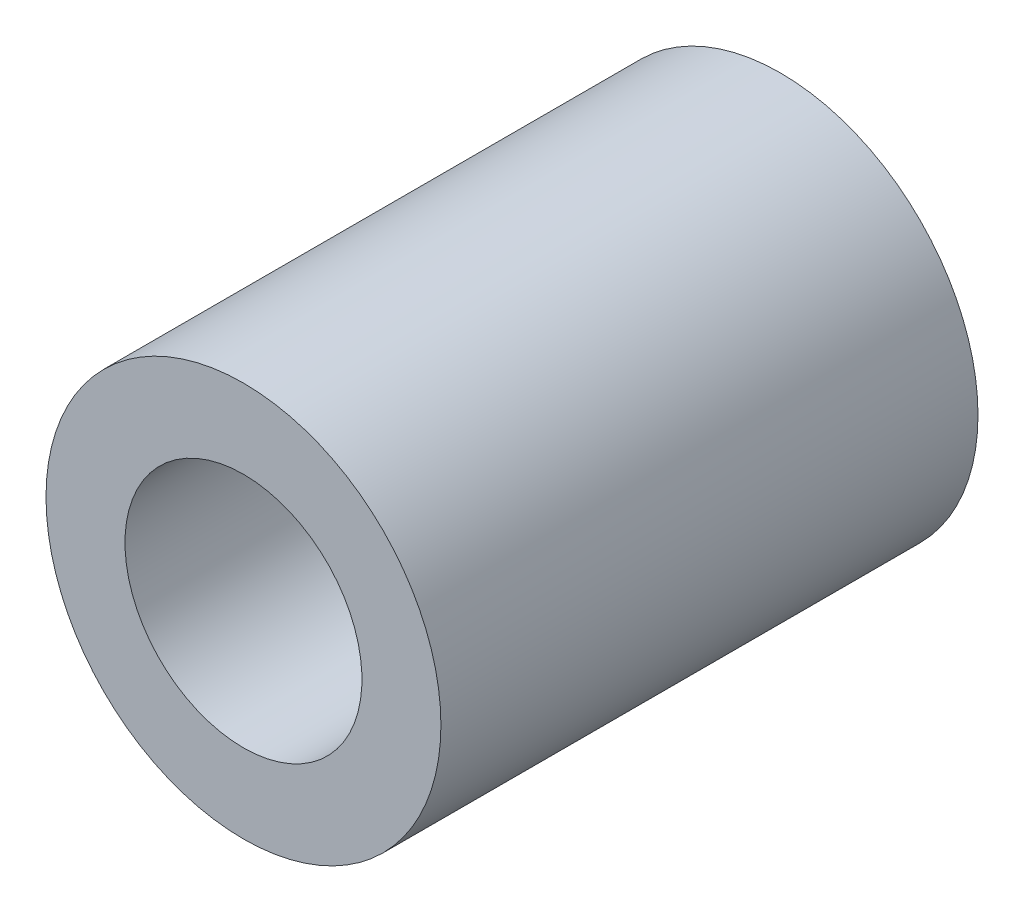
ISO-10303-21;
HEADER;
FILE_DESCRIPTION(('STEP AP214'),'2;1');
FILE_NAME('part.step','',(''),(''),'','','');
FILE_SCHEMA(('AUTOMOTIVE_DESIGN { 1 0 10303 214 1 1 1 1 }'));
ENDSEC;
DATA;
#1=APPLICATION_CONTEXT('core data for automotive mechanical design processes');
#2=APPLICATION_PROTOCOL_DEFINITION('international standard','automotive_design',2000,#1);
#3=PRODUCT_CONTEXT('',#1,'mechanical');
#4=PRODUCT('Part','Part','',(#3));
#5=PRODUCT_RELATED_PRODUCT_CATEGORY('part','',(#4));
#6=PRODUCT_DEFINITION_FORMATION('','',#4);
#7=PRODUCT_DEFINITION_CONTEXT('part definition',#1,'design');
#8=PRODUCT_DEFINITION('design','',#6,#7);
#9=PRODUCT_DEFINITION_SHAPE('','',#8);
#10=(LENGTH_UNIT() NAMED_UNIT(*) SI_UNIT(.MILLI.,.METRE.));
#11=(NAMED_UNIT(*) PLANE_ANGLE_UNIT() SI_UNIT($,.RADIAN.));
#12=(NAMED_UNIT(*) SI_UNIT($,.STERADIAN.) SOLID_ANGLE_UNIT());
#13=UNCERTAINTY_MEASURE_WITH_UNIT(LENGTH_MEASURE(1.E-05),#10,'distance_accuracy_value','');
#14=(GEOMETRIC_REPRESENTATION_CONTEXT(3) GLOBAL_UNCERTAINTY_ASSIGNED_CONTEXT((#13)) GLOBAL_UNIT_ASSIGNED_CONTEXT((#10,
#11,#12)) REPRESENTATION_CONTEXT('',''));
#15=CARTESIAN_POINT('',(0.,0.,0.));
#16=DIRECTION('',(0.,0.,1.));
#17=DIRECTION('',(1.,0.,0.));
#18=AXIS2_PLACEMENT_3D('',#15,#16,#17);
#19=CARTESIAN_POINT('',(-11.,5.5,-3.19999999999994));
#20=DIRECTION('',(0.,0.,-1.));
#21=DIRECTION('',(0.,1.,0.));
#22=AXIS2_PLACEMENT_3D('',#19,#20,#21);
#23=CYLINDRICAL_SURFACE('',#22,1.5);
#24=CARTESIAN_POINT('',(-11.,5.5,-9.99999999999993));
#25=DIRECTION('',(0.,0.,-1.));
#26=DIRECTION('',(0.,1.,0.));
#27=AXIS2_PLACEMENT_3D('',#24,#25,#26);
#28=CIRCLE('',#27,1.5);
#29=CARTESIAN_POINT('',(-11.,7.,-9.99999999999993));
#30=VERTEX_POINT('',#29);
#31=EDGE_CURVE('E18',#30,#30,#28,.T.);
#32=ORIENTED_EDGE('',*,*,#31,.T.);
#33=EDGE_LOOP('',(#32));
#34=FACE_BOUND('',#33,.T.);
#35=CARTESIAN_POINT('',(-11.,5.5,-3.19999999999994));
#36=DIRECTION('',(0.,0.,-1.));
#37=DIRECTION('',(0.,1.,0.));
#38=AXIS2_PLACEMENT_3D('',#35,#36,#37);
#39=CIRCLE('',#38,1.5);
#40=CARTESIAN_POINT('',(-11.,7.,-3.19999999999994));
#41=VERTEX_POINT('',#40);
#42=EDGE_CURVE('E27',#41,#41,#39,.T.);
#43=ORIENTED_EDGE('',*,*,#42,.F.);
#44=EDGE_LOOP('',(#43));
#45=FACE_BOUND('',#44,.T.);
#46=ADVANCED_FACE('F15',(#34,#45),#23,.F.);
#47=CARTESIAN_POINT('',(-11.,5.5,-9.99999999999993));
#48=DIRECTION('',(0.,0.,1.));
#49=DIRECTION('',(0.,-1.,0.));
#50=AXIS2_PLACEMENT_3D('',#47,#48,#49);
#51=PLANE('',#50);
#52=ORIENTED_EDGE('',*,*,#31,.F.);
#53=EDGE_LOOP('',(#52));
#54=FACE_BOUND('',#53,.T.);
#55=CARTESIAN_POINT('',(-11.,5.5,-9.99999999999993));
#56=DIRECTION('',(0.,0.,-1.));
#57=DIRECTION('',(0.,1.,0.));
#58=AXIS2_PLACEMENT_3D('',#55,#56,#57);
#59=CIRCLE('',#58,2.5);
#60=CARTESIAN_POINT('',(-11.,8.,-9.99999999999993));
#61=VERTEX_POINT('',#60);
#62=EDGE_CURVE('E22',#61,#61,#59,.F.);
#63=ORIENTED_EDGE('',*,*,#62,.F.);
#64=EDGE_LOOP('',(#63));
#65=FACE_BOUND('',#64,.T.);
#66=ADVANCED_FACE('F37',(#54,#65),#51,.F.);
#67=CARTESIAN_POINT('',(-11.,5.5,-3.19999999999994));
#68=DIRECTION('',(0.,0.,1.));
#69=DIRECTION('',(0.,-1.,0.));
#70=AXIS2_PLACEMENT_3D('',#67,#68,#69);
#71=PLANE('',#70);
#72=ORIENTED_EDGE('',*,*,#42,.T.);
#73=EDGE_LOOP('',(#72));
#74=FACE_BOUND('',#73,.T.);
#75=CARTESIAN_POINT('',(-11.,5.5,-3.19999999999994));
#76=DIRECTION('',(0.,0.,-1.));
#77=DIRECTION('',(0.,1.,0.));
#78=AXIS2_PLACEMENT_3D('',#75,#76,#77);
#79=CIRCLE('',#78,2.5);
#80=CARTESIAN_POINT('',(-11.,8.,-3.19999999999994));
#81=VERTEX_POINT('',#80);
#82=EDGE_CURVE('E10',#81,#81,#79,.T.);
#83=ORIENTED_EDGE('',*,*,#82,.F.);
#84=EDGE_LOOP('',(#83));
#85=FACE_BOUND('',#84,.T.);
#86=ADVANCED_FACE('F40',(#74,#85),#71,.T.);
#87=CARTESIAN_POINT('',(-11.,5.5,-3.19999999999994));
#88=DIRECTION('',(0.,0.,-1.));
#89=DIRECTION('',(0.,1.,0.));
#90=AXIS2_PLACEMENT_3D('',#87,#88,#89);
#91=CYLINDRICAL_SURFACE('',#90,2.5);
#92=ORIENTED_EDGE('',*,*,#82,.T.);
#93=EDGE_LOOP('',(#92));
#94=FACE_BOUND('',#93,.T.);
#95=ORIENTED_EDGE('',*,*,#62,.T.);
#96=EDGE_LOOP('',(#95));
#97=FACE_BOUND('',#96,.T.);
#98=ADVANCED_FACE('F43',(#94,#97),#91,.T.);
#99=CLOSED_SHELL('',(#46,#66,#86,#98));
#100=MANIFOLD_SOLID_BREP('B1',#99);
#101=ADVANCED_BREP_SHAPE_REPRESENTATION('',(#18,#100),#14);
#102=SHAPE_DEFINITION_REPRESENTATION(#9,#101);
ENDSEC;
END-ISO-10303-21;
